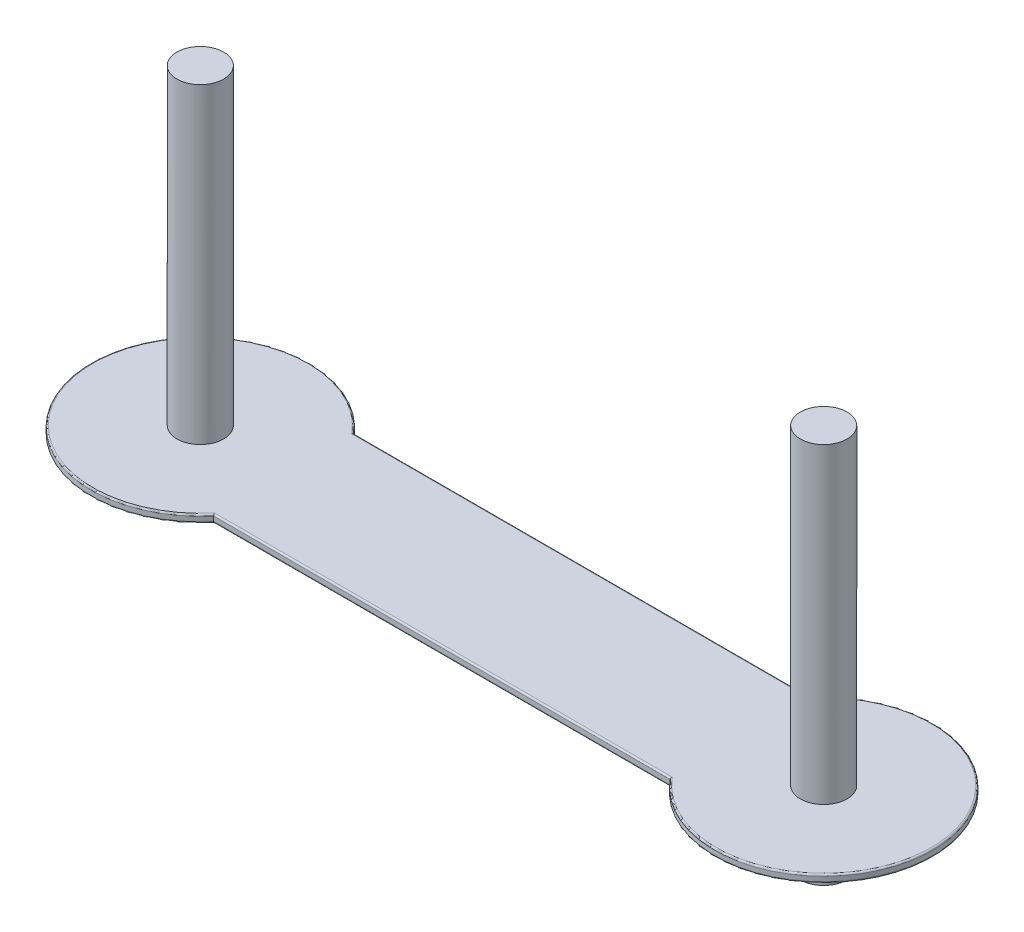
ISO-10303-21;
HEADER;
FILE_DESCRIPTION(('STEP AP214'),'2;1');
FILE_NAME('part.step','',(''),(''),'','','');
FILE_SCHEMA(('AUTOMOTIVE_DESIGN { 1 0 10303 214 1 1 1 1 }'));
ENDSEC;
DATA;
#1=APPLICATION_CONTEXT('core data for automotive mechanical design processes');
#2=APPLICATION_PROTOCOL_DEFINITION('international standard','automotive_design',2000,#1);
#3=PRODUCT_CONTEXT('',#1,'mechanical');
#4=PRODUCT('Part','Part','',(#3));
#5=PRODUCT_RELATED_PRODUCT_CATEGORY('part','',(#4));
#6=PRODUCT_DEFINITION_FORMATION('','',#4);
#7=PRODUCT_DEFINITION_CONTEXT('part definition',#1,'design');
#8=PRODUCT_DEFINITION('design','',#6,#7);
#9=PRODUCT_DEFINITION_SHAPE('','',#8);
#10=(LENGTH_UNIT() NAMED_UNIT(*) SI_UNIT(.MILLI.,.METRE.));
#11=(NAMED_UNIT(*) PLANE_ANGLE_UNIT() SI_UNIT($,.RADIAN.));
#12=(NAMED_UNIT(*) SI_UNIT($,.STERADIAN.) SOLID_ANGLE_UNIT());
#13=UNCERTAINTY_MEASURE_WITH_UNIT(LENGTH_MEASURE(1.E-05),#10,'distance_accuracy_value','');
#14=(GEOMETRIC_REPRESENTATION_CONTEXT(3) GLOBAL_UNCERTAINTY_ASSIGNED_CONTEXT((#13)) GLOBAL_UNIT_ASSIGNED_CONTEXT((#10,
#11,#12)) REPRESENTATION_CONTEXT('',''));
#15=CARTESIAN_POINT('',(0.,0.,0.));
#16=DIRECTION('',(0.,0.,1.));
#17=DIRECTION('',(1.,0.,0.));
#18=AXIS2_PLACEMENT_3D('',#15,#16,#17);
#19=CARTESIAN_POINT('',(-127.,3.175,0.));
#20=DIRECTION('',(0.,-1.,0.));
#21=DIRECTION('',(0.,0.,-1.));
#22=AXIS2_PLACEMENT_3D('',#19,#20,#21);
#23=CYLINDRICAL_SURFACE('',#22,44.45);
#24=DIRECTION('',(0.,-1.,0.));
#25=VECTOR('',#24,1.);
#26=CARTESIAN_POINT('',(-92.9519181891255,3.175,-28.575));
#27=LINE('',#26,#25);
#28=CARTESIAN_POINT('',(-92.9519181891255,2.54,-28.575));
#29=VERTEX_POINT('',#28);
#30=CARTESIAN_POINT('',(-92.9519181891255,0.635,-28.575));
#31=VERTEX_POINT('',#30);
#32=EDGE_CURVE('E119',#29,#31,#27,.T.);
#33=ORIENTED_EDGE('',*,*,#32,.T.);
#34=CARTESIAN_POINT('',(-127.,0.635,0.));
#35=DIRECTION('',(0.,-1.,0.));
#36=DIRECTION('',(0.,0.,-1.));
#37=AXIS2_PLACEMENT_3D('',#34,#35,#36);
#38=CIRCLE('',#37,44.45);
#39=CARTESIAN_POINT('',(-92.9519181891256,0.635,28.575));
#40=VERTEX_POINT('',#39);
#41=EDGE_CURVE('E127',#31,#40,#38,.F.);
#42=ORIENTED_EDGE('',*,*,#41,.T.);
#43=DIRECTION('',(0.,-1.,0.));
#44=VECTOR('',#43,1.);
#45=CARTESIAN_POINT('',(-92.9519181891256,3.175,28.575));
#46=LINE('',#45,#44);
#47=CARTESIAN_POINT('',(-92.9519181891256,2.54,28.575));
#48=VERTEX_POINT('',#47);
#49=EDGE_CURVE('E121',#48,#40,#46,.T.);
#50=ORIENTED_EDGE('',*,*,#49,.F.);
#51=CARTESIAN_POINT('',(-127.,2.54,0.));
#52=DIRECTION('',(0.,-1.,0.));
#53=DIRECTION('',(0.,0.,-1.));
#54=AXIS2_PLACEMENT_3D('',#51,#52,#53);
#55=CIRCLE('',#54,44.45);
#56=EDGE_CURVE('E117',#48,#29,#55,.T.);
#57=ORIENTED_EDGE('',*,*,#56,.T.);
#58=EDGE_LOOP('',(#33,#42,#50,#57));
#59=FACE_BOUND('',#58,.T.);
#60=ADVANCED_FACE('F45',(#59),#23,.T.);
#61=CARTESIAN_POINT('',(-92.9519181891256,3.175,28.575));
#62=DIRECTION('',(0.,0.,-1.));
#63=DIRECTION('',(-1.,0.,0.));
#64=AXIS2_PLACEMENT_3D('',#61,#62,#63);
#65=PLANE('',#64);
#66=ORIENTED_EDGE('',*,*,#49,.T.);
#67=DIRECTION('',(1.,0.,0.));
#68=VECTOR('',#67,1.);
#69=CARTESIAN_POINT('',(92.9519181891255,0.635,28.575));
#70=LINE('',#69,#68);
#71=CARTESIAN_POINT('',(92.9519181891255,0.635,28.575));
#72=VERTEX_POINT('',#71);
#73=EDGE_CURVE('E128',#40,#72,#70,.T.);
#74=ORIENTED_EDGE('',*,*,#73,.T.);
#75=DIRECTION('',(0.,-1.,0.));
#76=VECTOR('',#75,1.);
#77=CARTESIAN_POINT('',(92.9519181891255,3.175,28.575));
#78=LINE('',#77,#76);
#79=CARTESIAN_POINT('',(92.9519181891255,2.54,28.575));
#80=VERTEX_POINT('',#79);
#81=EDGE_CURVE('E311',#80,#72,#78,.T.);
#82=ORIENTED_EDGE('',*,*,#81,.F.);
#83=DIRECTION('',(1.,0.,0.));
#84=VECTOR('',#83,1.);
#85=CARTESIAN_POINT('',(-92.9519181891256,2.54,28.575));
#86=LINE('',#85,#84);
#87=EDGE_CURVE('E285',#80,#48,#86,.F.);
#88=ORIENTED_EDGE('',*,*,#87,.T.);
#89=EDGE_LOOP('',(#66,#74,#82,#88));
#90=FACE_BOUND('',#89,.T.);
#91=ADVANCED_FACE('F197',(#90),#65,.F.);
#92=CARTESIAN_POINT('',(127.,3.175,0.));
#93=DIRECTION('',(0.,-1.,0.));
#94=DIRECTION('',(0.,0.,-1.));
#95=AXIS2_PLACEMENT_3D('',#92,#93,#94);
#96=CYLINDRICAL_SURFACE('',#95,44.45);
#97=ORIENTED_EDGE('',*,*,#81,.T.);
#98=CARTESIAN_POINT('',(127.,0.635,0.));
#99=DIRECTION('',(0.,-1.,0.));
#100=DIRECTION('',(0.,0.,-1.));
#101=AXIS2_PLACEMENT_3D('',#98,#99,#100);
#102=CIRCLE('',#101,44.45);
#103=CARTESIAN_POINT('',(92.9519181891256,0.635,-28.575));
#104=VERTEX_POINT('',#103);
#105=EDGE_CURVE('E282',#72,#104,#102,.F.);
#106=ORIENTED_EDGE('',*,*,#105,.T.);
#107=DIRECTION('',(0.,-1.,0.));
#108=VECTOR('',#107,1.);
#109=CARTESIAN_POINT('',(92.9519181891256,3.175,-28.575));
#110=LINE('',#109,#108);
#111=CARTESIAN_POINT('',(92.9519181891256,2.54,-28.575));
#112=VERTEX_POINT('',#111);
#113=EDGE_CURVE('E141',#112,#104,#110,.T.);
#114=ORIENTED_EDGE('',*,*,#113,.F.);
#115=CARTESIAN_POINT('',(127.,2.54,0.));
#116=DIRECTION('',(0.,-1.,0.));
#117=DIRECTION('',(0.,0.,-1.));
#118=AXIS2_PLACEMENT_3D('',#115,#116,#117);
#119=CIRCLE('',#118,44.45);
#120=EDGE_CURVE('E279',#112,#80,#119,.T.);
#121=ORIENTED_EDGE('',*,*,#120,.T.);
#122=EDGE_LOOP('',(#97,#106,#114,#121));
#123=FACE_BOUND('',#122,.T.);
#124=ADVANCED_FACE('F203',(#123),#96,.T.);
#125=CARTESIAN_POINT('',(92.9519181891256,3.175,-28.575));
#126=DIRECTION('',(0.,0.,1.));
#127=DIRECTION('',(1.,0.,0.));
#128=AXIS2_PLACEMENT_3D('',#125,#126,#127);
#129=PLANE('',#128);
#130=ORIENTED_EDGE('',*,*,#113,.T.);
#131=DIRECTION('',(-1.,0.,0.));
#132=VECTOR('',#131,1.);
#133=CARTESIAN_POINT('',(-92.9519181891255,0.635,-28.575));
#134=LINE('',#133,#132);
#135=EDGE_CURVE('E139',#104,#31,#134,.T.);
#136=ORIENTED_EDGE('',*,*,#135,.T.);
#137=ORIENTED_EDGE('',*,*,#32,.F.);
#138=DIRECTION('',(-1.,0.,0.));
#139=VECTOR('',#138,1.);
#140=CARTESIAN_POINT('',(92.9519181891256,2.54,-28.575));
#141=LINE('',#140,#139);
#142=EDGE_CURVE('E136',#29,#112,#141,.F.);
#143=ORIENTED_EDGE('',*,*,#142,.T.);
#144=EDGE_LOOP('',(#130,#136,#137,#143));
#145=FACE_BOUND('',#144,.T.);
#146=ADVANCED_FACE('F135',(#145),#129,.F.);
#147=CARTESIAN_POINT('',(-127.,3.175,0.));
#148=DIRECTION('',(0.,-1.,0.));
#149=DIRECTION('',(0.,0.,-1.));
#150=AXIS2_PLACEMENT_3D('',#147,#148,#149);
#151=PLANE('',#150);
#152=CARTESIAN_POINT('',(127.,3.175,0.));
#153=DIRECTION('',(0.,-1.,0.));
#154=DIRECTION('',(0.,0.,-1.));
#155=AXIS2_PLACEMENT_3D('',#152,#153,#154);
#156=CIRCLE('',#155,43.815);
#157=CARTESIAN_POINT('',(93.2492870445675,3.175,27.94));
#158=VERTEX_POINT('',#157);
#159=CARTESIAN_POINT('',(93.2492870445675,3.175,-27.94));
#160=VERTEX_POINT('',#159);
#161=EDGE_CURVE('E60',#158,#160,#156,.F.);
#162=ORIENTED_EDGE('',*,*,#161,.T.);
#163=DIRECTION('',(-1.,0.,0.));
#164=VECTOR('',#163,1.);
#165=CARTESIAN_POINT('',(-127.,3.175,-27.94));
#166=LINE('',#165,#164);
#167=CARTESIAN_POINT('',(-93.2492870445675,3.175,-27.94));
#168=VERTEX_POINT('',#167);
#169=EDGE_CURVE('E11',#160,#168,#166,.T.);
#170=ORIENTED_EDGE('',*,*,#169,.T.);
#171=CARTESIAN_POINT('',(-127.,3.175,0.));
#172=DIRECTION('',(0.,-1.,0.));
#173=DIRECTION('',(0.,0.,-1.));
#174=AXIS2_PLACEMENT_3D('',#171,#172,#173);
#175=CIRCLE('',#174,43.815);
#176=CARTESIAN_POINT('',(-93.2492870445675,3.175,27.94));
#177=VERTEX_POINT('',#176);
#178=EDGE_CURVE('E155',#168,#177,#175,.F.);
#179=ORIENTED_EDGE('',*,*,#178,.T.);
#180=DIRECTION('',(1.,0.,0.));
#181=VECTOR('',#180,1.);
#182=CARTESIAN_POINT('',(-127.,3.175,27.94));
#183=LINE('',#182,#181);
#184=EDGE_CURVE('E71',#177,#158,#183,.T.);
#185=ORIENTED_EDGE('',*,*,#184,.T.);
#186=EDGE_LOOP('',(#162,#170,#179,#185));
#187=FACE_BOUND('',#186,.T.);
#188=CARTESIAN_POINT('',(127.,3.175,0.));
#189=DIRECTION('',(0.,-1.,0.));
#190=DIRECTION('',(0.,0.,-1.));
#191=AXIS2_PLACEMENT_3D('',#188,#189,#190);
#192=CIRCLE('',#191,9.52499999999996);
#193=CARTESIAN_POINT('',(127.,3.175,-9.52499999999996));
#194=VERTEX_POINT('',#193);
#195=EDGE_CURVE('E356',#194,#194,#192,.T.);
#196=ORIENTED_EDGE('',*,*,#195,.T.);
#197=EDGE_LOOP('',(#196));
#198=FACE_BOUND('',#197,.T.);
#199=CARTESIAN_POINT('',(-127.,3.17500000000001,0.));
#200=DIRECTION('',(0.,-1.,0.));
#201=DIRECTION('',(0.,0.,-1.));
#202=AXIS2_PLACEMENT_3D('',#199,#200,#201);
#203=CIRCLE('',#202,9.52500000000001);
#204=CARTESIAN_POINT('',(-127.,3.17500000000001,-9.52499999999998));
#205=VERTEX_POINT('',#204);
#206=EDGE_CURVE('E310',#205,#205,#203,.F.);
#207=ORIENTED_EDGE('',*,*,#206,.F.);
#208=EDGE_LOOP('',(#207));
#209=FACE_BOUND('',#208,.T.);
#210=ADVANCED_FACE('F297',(#187,#198,#209),#151,.F.);
#211=CARTESIAN_POINT('',(-127.,0.,0.));
#212=DIRECTION('',(0.,-1.,0.));
#213=DIRECTION('',(0.,0.,-1.));
#214=AXIS2_PLACEMENT_3D('',#211,#212,#213);
#215=PLANE('',#214);
#216=CARTESIAN_POINT('',(-127.,0.,0.));
#217=DIRECTION('',(0.,-1.,0.));
#218=DIRECTION('',(0.,0.,-1.));
#219=AXIS2_PLACEMENT_3D('',#216,#217,#218);
#220=CIRCLE('',#219,43.815);
#221=CARTESIAN_POINT('',(-93.2492870445675,0.,27.94));
#222=VERTEX_POINT('',#221);
#223=CARTESIAN_POINT('',(-93.2492870445675,0.,-27.94));
#224=VERTEX_POINT('',#223);
#225=EDGE_CURVE('E262',#222,#224,#220,.T.);
#226=ORIENTED_EDGE('',*,*,#225,.T.);
#227=DIRECTION('',(-1.,0.,0.));
#228=VECTOR('',#227,1.);
#229=CARTESIAN_POINT('',(92.9519181891256,0.,-27.94));
#230=LINE('',#229,#228);
#231=CARTESIAN_POINT('',(93.2492870445675,0.,-27.94));
#232=VERTEX_POINT('',#231);
#233=EDGE_CURVE('E276',#224,#232,#230,.F.);
#234=ORIENTED_EDGE('',*,*,#233,.T.);
#235=CARTESIAN_POINT('',(127.,0.,0.));
#236=DIRECTION('',(0.,-1.,0.));
#237=DIRECTION('',(0.,0.,-1.));
#238=AXIS2_PLACEMENT_3D('',#235,#236,#237);
#239=CIRCLE('',#238,43.815);
#240=CARTESIAN_POINT('',(93.2492870445675,0.,27.94));
#241=VERTEX_POINT('',#240);
#242=EDGE_CURVE('E270',#232,#241,#239,.T.);
#243=ORIENTED_EDGE('',*,*,#242,.T.);
#244=DIRECTION('',(1.,0.,0.));
#245=VECTOR('',#244,1.);
#246=CARTESIAN_POINT('',(-92.9519181891256,0.,27.94));
#247=LINE('',#246,#245);
#248=EDGE_CURVE('E256',#241,#222,#247,.F.);
#249=ORIENTED_EDGE('',*,*,#248,.T.);
#250=EDGE_LOOP('',(#226,#234,#243,#249));
#251=FACE_BOUND('',#250,.T.);
#252=CARTESIAN_POINT('',(127.,0.,0.));
#253=DIRECTION('',(0.,-1.,0.));
#254=DIRECTION('',(0.,0.,-1.));
#255=AXIS2_PLACEMENT_3D('',#252,#253,#254);
#256=CIRCLE('',#255,9.52499999999996);
#257=CARTESIAN_POINT('',(127.,0.,-9.52499999999996));
#258=VERTEX_POINT('',#257);
#259=EDGE_CURVE('E152',#258,#258,#256,.T.);
#260=ORIENTED_EDGE('',*,*,#259,.F.);
#261=EDGE_LOOP('',(#260));
#262=FACE_BOUND('',#261,.T.);
#263=ADVANCED_FACE('F327',(#251,#262),#215,.T.);
#264=CARTESIAN_POINT('',(-127.,130.175,0.));
#265=DIRECTION('',(0.,-1.,0.));
#266=DIRECTION('',(0.,0.,-1.));
#267=AXIS2_PLACEMENT_3D('',#264,#265,#266);
#268=CYLINDRICAL_SURFACE('',#267,9.52500000000001);
#269=CARTESIAN_POINT('',(-127.,130.175,0.));
#270=DIRECTION('',(0.,1.,0.));
#271=DIRECTION('',(0.,0.,1.));
#272=AXIS2_PLACEMENT_3D('',#269,#270,#271);
#273=CIRCLE('',#272,9.52500000000001);
#274=CARTESIAN_POINT('',(-127.,130.175,9.52500000000004));
#275=VERTEX_POINT('',#274);
#276=EDGE_CURVE('E142',#275,#275,#273,.T.);
#277=ORIENTED_EDGE('',*,*,#276,.F.);
#278=EDGE_LOOP('',(#277));
#279=FACE_BOUND('',#278,.T.);
#280=ORIENTED_EDGE('',*,*,#206,.T.);
#281=EDGE_LOOP('',(#280));
#282=FACE_BOUND('',#281,.T.);
#283=ADVANCED_FACE('F328',(#279,#282),#268,.T.);
#284=CARTESIAN_POINT('',(-127.,130.175,0.));
#285=DIRECTION('',(0.,1.,0.));
#286=DIRECTION('',(0.,0.,1.));
#287=AXIS2_PLACEMENT_3D('',#284,#285,#286);
#288=PLANE('',#287);
#289=ORIENTED_EDGE('',*,*,#276,.T.);
#290=EDGE_LOOP('',(#289));
#291=FACE_BOUND('',#290,.T.);
#292=ADVANCED_FACE('F334',(#291),#288,.T.);
#293=CARTESIAN_POINT('',(127.,-25.4,0.));
#294=DIRECTION('',(0.,1.,0.));
#295=DIRECTION('',(0.,0.,1.));
#296=AXIS2_PLACEMENT_3D('',#293,#294,#295);
#297=PLANE('',#296);
#298=CARTESIAN_POINT('',(127.,-25.4,0.));
#299=DIRECTION('',(0.,1.,0.));
#300=DIRECTION('',(0.,0.,1.));
#301=AXIS2_PLACEMENT_3D('',#298,#299,#300);
#302=CIRCLE('',#301,9.52499999999996);
#303=CARTESIAN_POINT('',(127.,-25.4,9.52499999999996));
#304=VERTEX_POINT('',#303);
#305=EDGE_CURVE('E351',#304,#304,#302,.T.);
#306=ORIENTED_EDGE('',*,*,#305,.F.);
#307=EDGE_LOOP('',(#306));
#308=FACE_BOUND('',#307,.T.);
#309=ADVANCED_FACE('F371',(#308),#297,.F.);
#310=CARTESIAN_POINT('',(127.,-25.4,0.));
#311=DIRECTION('',(0.,1.,0.));
#312=DIRECTION('',(0.,0.,1.));
#313=AXIS2_PLACEMENT_3D('',#310,#311,#312);
#314=CYLINDRICAL_SURFACE('',#313,9.52499999999996);
#315=ORIENTED_EDGE('',*,*,#259,.T.);
#316=EDGE_LOOP('',(#315));
#317=FACE_BOUND('',#316,.T.);
#318=ORIENTED_EDGE('',*,*,#305,.T.);
#319=EDGE_LOOP('',(#318));
#320=FACE_BOUND('',#319,.T.);
#321=ADVANCED_FACE('F324',(#317,#320),#314,.T.);
#322=CARTESIAN_POINT('',(127.,130.175,0.));
#323=DIRECTION('',(0.,1.,0.));
#324=DIRECTION('',(0.,0.,1.));
#325=AXIS2_PLACEMENT_3D('',#322,#323,#324);
#326=CIRCLE('',#325,9.52499999999996);
#327=CARTESIAN_POINT('',(127.,130.175,9.52499999999996));
#328=VERTEX_POINT('',#327);
#329=EDGE_CURVE('E347',#328,#328,#326,.T.);
#330=ORIENTED_EDGE('',*,*,#329,.F.);
#331=EDGE_LOOP('',(#330));
#332=FACE_BOUND('',#331,.T.);
#333=ORIENTED_EDGE('',*,*,#195,.F.);
#334=EDGE_LOOP('',(#333));
#335=FACE_BOUND('',#334,.T.);
#336=ADVANCED_FACE('F247',(#332,#335),#314,.T.);
#337=CARTESIAN_POINT('',(127.,130.175,0.));
#338=DIRECTION('',(0.,1.,0.));
#339=DIRECTION('',(0.,0.,1.));
#340=AXIS2_PLACEMENT_3D('',#337,#338,#339);
#341=PLANE('',#340);
#342=ORIENTED_EDGE('',*,*,#329,.T.);
#343=EDGE_LOOP('',(#342));
#344=FACE_BOUND('',#343,.T.);
#345=ADVANCED_FACE('F241',(#344),#341,.T.);
#346=CARTESIAN_POINT('',(-92.9519181891256,0.635,27.94));
#347=DIRECTION('',(-1.,0.,0.));
#348=DIRECTION('',(0.,0.,1.));
#349=AXIS2_PLACEMENT_3D('',#346,#347,#348);
#350=CYLINDRICAL_SURFACE('',#349,0.635);
#351=CARTESIAN_POINT('',(-92.9519181891256,0.635,28.575));
#352=CARTESIAN_POINT('',(-92.9519000690773,0.601678653821247,28.5750394021504));
#353=CARTESIAN_POINT('',(-92.9531397768955,0.56838559440662,28.5723799878432));
#354=CARTESIAN_POINT('',(-92.957991182427,0.502888793551069,28.5619757165325));
#355=CARTESIAN_POINT('',(-92.9615951356801,0.470681855272648,28.5542474633297));
#356=CARTESIAN_POINT('',(-92.9710309494502,0.408174635970745,28.5340185471485));
#357=CARTESIAN_POINT('',(-92.9768618227916,0.377873517035022,28.5215199988049));
#358=CARTESIAN_POINT('',(-92.9905193658937,0.319890606059719,28.4922551558196));
#359=CARTESIAN_POINT('',(-92.998347055114,0.292210161913789,28.4754866812065));
#360=CARTESIAN_POINT('',(-93.0160538323616,0.239079797363762,28.4375713756068));
#361=CARTESIAN_POINT('',(-93.0259989264897,0.213752701306818,28.4162837529325));
#362=CARTESIAN_POINT('',(-93.0474245060057,0.167010457954683,28.3704454467679));
#363=CARTESIAN_POINT('',(-93.0589054635671,0.145596518498023,28.3458937598144));
#364=CARTESIAN_POINT('',(-93.0841600008306,0.105271927238983,28.2919182632674));
#365=CARTESIAN_POINT('',(-93.0980466333784,0.0867524357029992,28.2622554092274));
#366=CARTESIAN_POINT('',(-93.1268793022116,0.0549506683469874,28.2007078102434));
#367=CARTESIAN_POINT('',(-93.1418259397677,0.0416713934432824,28.1688218044284));
#368=CARTESIAN_POINT('',(-93.1716608140322,0.0210031753433222,28.1052187453314));
#369=CARTESIAN_POINT('',(-93.186516936976,0.013360489976038,28.0735680561674));
#370=CARTESIAN_POINT('',(-93.2165311703958,0.00300652726968431,28.0096666709503));
#371=CARTESIAN_POINT('',(-93.231688601593,0.000285202760250801,27.9774173334421));
#372=CARTESIAN_POINT('',(-93.2476577167473,7.0716198331565E-06,27.9434640606723));
#373=CARTESIAN_POINT('',(-93.2484723981043,-1.57192980673113E-08,27.9417319615877));
#374=CARTESIAN_POINT('',(-93.2492870445675,0.,27.94));
#375=B_SPLINE_CURVE_WITH_KNOTS('',3,(#351,#352,#353,#354,#355,#356,#357,#358,#359,#360,#361,
#362,#363,#364,#365,#366,#367,#368,#369,#370,#371,#372,#373,#374),.UNSPECIFIED.,.F.,.F.,(4,2,2,
2,2,2,2,2,2,2,2,4),(0.,0.0997910014508765,0.199256743015672,0.298678443306542,0.398151004556693,
0.501359653404448,0.604600105118342,0.717008472453579,0.829481119624646,0.936516009933089,
1.04333213615029,1.04907448757736),.UNSPECIFIED.);
#376=EDGE_CURVE('E228',#222,#40,#375,.F.);
#377=ORIENTED_EDGE('',*,*,#376,.F.);
#378=ORIENTED_EDGE('',*,*,#248,.F.);
#379=CARTESIAN_POINT('',(92.9519181891255,0.635,28.575));
#380=CARTESIAN_POINT('',(92.9519000690773,0.601678653821248,28.5750394021504));
#381=CARTESIAN_POINT('',(92.9531397768955,0.568385594406621,28.5723799878432));
#382=CARTESIAN_POINT('',(92.9579911824271,0.502888793551068,28.5619757165325));
#383=CARTESIAN_POINT('',(92.9615951356802,0.470681855272647,28.5542474633297));
#384=CARTESIAN_POINT('',(92.9710309494502,0.408174635970742,28.5340185471485));
#385=CARTESIAN_POINT('',(92.9768618227916,0.377873517035018,28.5215199988049));
#386=CARTESIAN_POINT('',(92.9905193658937,0.319890606059716,28.4922551558196));
#387=CARTESIAN_POINT('',(92.998347055114,0.292210161913787,28.4754866812065));
#388=CARTESIAN_POINT('',(93.0160538323616,0.239079797363763,28.4375713756068));
#389=CARTESIAN_POINT('',(93.0259989264897,0.21375270130682,28.4162837529325));
#390=CARTESIAN_POINT('',(93.0474245060057,0.167010457954685,28.3704454467679));
#391=CARTESIAN_POINT('',(93.0589054635671,0.145596518498025,28.3458937598144));
#392=CARTESIAN_POINT('',(93.0841600008306,0.105271927238985,28.2919182632674));
#393=CARTESIAN_POINT('',(93.0980466333784,0.0867524357029992,28.2622554092274));
#394=CARTESIAN_POINT('',(93.1268793022116,0.0549506683469867,28.2007078102434));
#395=CARTESIAN_POINT('',(93.1418259397678,0.0416713934432829,28.1688218044284));
#396=CARTESIAN_POINT('',(93.1716608140322,0.0210031753433226,28.1052187453314));
#397=CARTESIAN_POINT('',(93.186516936976,0.0133604899760366,28.0735680561674));
#398=CARTESIAN_POINT('',(93.2165311703959,0.00300652726968312,28.0096666709504));
#399=CARTESIAN_POINT('',(93.2316886015932,0.000285202760251281,27.9774173334422));
#400=CARTESIAN_POINT('',(93.2476577167473,7.07161983323827E-06,27.9434640606723));
#401=CARTESIAN_POINT('',(93.2484723981044,-1.57192980128847E-08,27.9417319615877));
#402=CARTESIAN_POINT('',(93.2492870445675,0.,27.94));
#403=B_SPLINE_CURVE_WITH_KNOTS('',3,(#379,#380,#381,#382,#383,#384,#385,#386,#387,#388,#389,
#390,#391,#392,#393,#394,#395,#396,#397,#398,#399,#400,#401,#402),.UNSPECIFIED.,.F.,.F.,(4,2,2,
2,2,2,2,2,2,2,2,4),(0.,0.099791001450877,0.199256743015672,0.298678443306548,0.398151004556696,
0.501359653404441,0.604600105118344,0.717008472453578,0.829481119624657,0.936516009933097,
1.04333213615029,1.04907448757735),.UNSPECIFIED.);
#404=EDGE_CURVE('E168',#72,#241,#403,.T.);
#405=ORIENTED_EDGE('',*,*,#404,.F.);
#406=ORIENTED_EDGE('',*,*,#73,.F.);
#407=EDGE_LOOP('',(#377,#378,#405,#406));
#408=FACE_BOUND('',#407,.T.);
#409=ADVANCED_FACE('F236',(#408),#350,.T.);
#410=CARTESIAN_POINT('',(127.,0.635,0.));
#411=DIRECTION('',(0.,-1.,0.));
#412=DIRECTION('',(0.,0.,-1.));
#413=AXIS2_PLACEMENT_3D('',#410,#411,#412);
#414=TOROIDAL_SURFACE('',#413,43.815,0.635);
#415=ORIENTED_EDGE('',*,*,#404,.T.);
#416=ORIENTED_EDGE('',*,*,#242,.F.);
#417=CARTESIAN_POINT('',(92.9519181891256,0.635,-28.575));
#418=CARTESIAN_POINT('',(92.9519000690773,0.601678653821249,-28.5750394021504));
#419=CARTESIAN_POINT('',(92.9531397768955,0.568385594406622,-28.5723799878432));
#420=CARTESIAN_POINT('',(92.9579911824271,0.502888793551069,-28.5619757165325));
#421=CARTESIAN_POINT('',(92.9615951356802,0.470681855272647,-28.5542474633297));
#422=CARTESIAN_POINT('',(92.9710309494502,0.408174635970744,-28.5340185471485));
#423=CARTESIAN_POINT('',(92.9768618227916,0.377873517035023,-28.5215199988049));
#424=CARTESIAN_POINT('',(92.9905193658937,0.31989060605972,-28.4922551558196));
#425=CARTESIAN_POINT('',(92.998347055114,0.292210161913789,-28.4754866812065));
#426=CARTESIAN_POINT('',(93.0160538323616,0.239079797363762,-28.4375713756068));
#427=CARTESIAN_POINT('',(93.0259989264897,0.213752701306819,-28.4162837529325));
#428=CARTESIAN_POINT('',(93.0474245060058,0.167010457954684,-28.3704454467679));
#429=CARTESIAN_POINT('',(93.0589054635671,0.145596518498024,-28.3458937598144));
#430=CARTESIAN_POINT('',(93.0841600008306,0.105271927238984,-28.2919182632674));
#431=CARTESIAN_POINT('',(93.0980466333784,0.0867524357030004,-28.2622554092274));
#432=CARTESIAN_POINT('',(93.1268793022116,0.0549506683469884,-28.2007078102434));
#433=CARTESIAN_POINT('',(93.1418259397678,0.041671393443283,-28.1688218044284));
#434=CARTESIAN_POINT('',(93.1716608140322,0.0210031753433225,-28.1052187453314));
#435=CARTESIAN_POINT('',(93.186516936976,0.0133604899760382,-28.0735680561674));
#436=CARTESIAN_POINT('',(93.2165311703959,0.00300652726968469,-28.0096666709503));
#437=CARTESIAN_POINT('',(93.2316886015931,0.000285202760251183,-27.9774173334421));
#438=CARTESIAN_POINT('',(93.2476577167473,7.07161983320866E-06,-27.9434640606723));
#439=CARTESIAN_POINT('',(93.2484723981044,-1.57192980336552E-08,-27.9417319615877));
#440=CARTESIAN_POINT('',(93.2492870445675,0.,-27.94));
#441=B_SPLINE_CURVE_WITH_KNOTS('',3,(#417,#418,#419,#420,#421,#422,#423,#424,#425,#426,#427,
#428,#429,#430,#431,#432,#433,#434,#435,#436,#437,#438,#439,#440),.UNSPECIFIED.,.F.,.F.,(4,2,2,
2,2,2,2,2,2,2,2,4),(0.,0.0997910014508769,0.199256743015671,0.298678443306544,0.398151004556696,
0.501359653404449,0.604600105118343,0.717008472453577,0.829481119624648,0.93651600993309,
1.04333213615029,1.04907448757735),.UNSPECIFIED.);
#442=EDGE_CURVE('E222',#104,#232,#441,.T.);
#443=ORIENTED_EDGE('',*,*,#442,.F.);
#444=ORIENTED_EDGE('',*,*,#105,.F.);
#445=EDGE_LOOP('',(#415,#416,#443,#444));
#446=FACE_BOUND('',#445,.T.);
#447=ADVANCED_FACE('F233',(#446),#414,.T.);
#448=CARTESIAN_POINT('',(-127.,0.635,0.));
#449=DIRECTION('',(0.,-1.,0.));
#450=DIRECTION('',(0.,0.,-1.));
#451=AXIS2_PLACEMENT_3D('',#448,#449,#450);
#452=TOROIDAL_SURFACE('',#451,43.815,0.635);
#453=ORIENTED_EDGE('',*,*,#376,.T.);
#454=ORIENTED_EDGE('',*,*,#41,.F.);
#455=CARTESIAN_POINT('',(-92.9519181891255,0.635,-28.575));
#456=CARTESIAN_POINT('',(-92.9519000690773,0.601678653821249,-28.5750394021503));
#457=CARTESIAN_POINT('',(-92.9531397768955,0.568385594406622,-28.5723799878432));
#458=CARTESIAN_POINT('',(-92.9579911824271,0.502888793551069,-28.5619757165325));
#459=CARTESIAN_POINT('',(-92.9615951356802,0.470681855272647,-28.5542474633297));
#460=CARTESIAN_POINT('',(-92.9710309494502,0.408174635970742,-28.5340185471485));
#461=CARTESIAN_POINT('',(-92.9768618227916,0.377873517035018,-28.5215199988048));
#462=CARTESIAN_POINT('',(-92.9905193658937,0.319890606059716,-28.4922551558196));
#463=CARTESIAN_POINT('',(-92.998347055114,0.292210161913786,-28.4754866812065));
#464=CARTESIAN_POINT('',(-93.0160538323616,0.239079797363762,-28.4375713756068));
#465=CARTESIAN_POINT('',(-93.0259989264897,0.213752701306819,-28.4162837529325));
#466=CARTESIAN_POINT('',(-93.0474245060058,0.167010457954684,-28.3704454467678));
#467=CARTESIAN_POINT('',(-93.0589054635671,0.145596518498024,-28.3458937598143));
#468=CARTESIAN_POINT('',(-93.0841600008306,0.105271927238984,-28.2919182632673));
#469=CARTESIAN_POINT('',(-93.0980466333784,0.0867524357029991,-28.2622554092274));
#470=CARTESIAN_POINT('',(-93.1268793022116,0.054950668346987,-28.2007078102434));
#471=CARTESIAN_POINT('',(-93.1418259397678,0.0416713934432829,-28.1688218044284));
#472=CARTESIAN_POINT('',(-93.1716608140322,0.0210031753433225,-28.1052187453314));
#473=CARTESIAN_POINT('',(-93.186516936976,0.0133604899760366,-28.0735680561674));
#474=CARTESIAN_POINT('',(-93.2165311703959,0.00300652726968315,-28.0096666709503));
#475=CARTESIAN_POINT('',(-93.2316886015932,0.000285202760251283,-27.9774173334421));
#476=CARTESIAN_POINT('',(-93.2476577167473,7.0716198332382E-06,-27.9434640606723));
#477=CARTESIAN_POINT('',(-93.2484723981044,-1.57192980129611E-08,-27.9417319615876));
#478=CARTESIAN_POINT('',(-93.2492870445675,0.,-27.94));
#479=B_SPLINE_CURVE_WITH_KNOTS('',3,(#455,#456,#457,#458,#459,#460,#461,#462,#463,#464,#465,
#466,#467,#468,#469,#470,#471,#472,#473,#474,#475,#476,#477,#478),.UNSPECIFIED.,.F.,.F.,(4,2,2,
2,2,2,2,2,2,2,2,4),(0.,0.0997910014508774,0.199256743015673,0.29867844330655,0.398151004556698,
0.501359653404451,0.604600105118345,0.717008472453579,0.829481119624658,0.936516009933098,
1.04333213615029,1.04907448757736),.UNSPECIFIED.);
#480=EDGE_CURVE('E216',#224,#31,#479,.F.);
#481=ORIENTED_EDGE('',*,*,#480,.F.);
#482=ORIENTED_EDGE('',*,*,#225,.F.);
#483=EDGE_LOOP('',(#453,#454,#481,#482));
#484=FACE_BOUND('',#483,.T.);
#485=ADVANCED_FACE('F211',(#484),#452,.T.);
#486=CARTESIAN_POINT('',(92.9519181891256,0.635,-27.94));
#487=DIRECTION('',(1.,0.,0.));
#488=DIRECTION('',(0.,0.,-1.));
#489=AXIS2_PLACEMENT_3D('',#486,#487,#488);
#490=CYLINDRICAL_SURFACE('',#489,0.635);
#491=ORIENTED_EDGE('',*,*,#442,.T.);
#492=ORIENTED_EDGE('',*,*,#233,.F.);
#493=ORIENTED_EDGE('',*,*,#480,.T.);
#494=ORIENTED_EDGE('',*,*,#135,.F.);
#495=EDGE_LOOP('',(#491,#492,#493,#494));
#496=FACE_BOUND('',#495,.T.);
#497=ADVANCED_FACE('F193',(#496),#490,.T.);
#498=CARTESIAN_POINT('',(-127.,2.54,27.94));
#499=DIRECTION('',(1.,0.,0.));
#500=DIRECTION('',(0.,0.,-1.));
#501=AXIS2_PLACEMENT_3D('',#498,#499,#500);
#502=CYLINDRICAL_SURFACE('',#501,0.635);
#503=CARTESIAN_POINT('',(-92.9519181891256,2.54,28.575));
#504=CARTESIAN_POINT('',(-92.9519000690773,2.57332134617875,28.5750394021504));
#505=CARTESIAN_POINT('',(-92.9531397768955,2.60661440559338,28.5723799878432));
#506=CARTESIAN_POINT('',(-92.957991182427,2.67211120644893,28.5619757165325));
#507=CARTESIAN_POINT('',(-92.9615951356801,2.70431814472735,28.5542474633297));
#508=CARTESIAN_POINT('',(-92.9710309494502,2.76682536402925,28.5340185471485));
#509=CARTESIAN_POINT('',(-92.9768618227916,2.79712648296498,28.5215199988049));
#510=CARTESIAN_POINT('',(-92.9905193658937,2.85510939394028,28.4922551558196));
#511=CARTESIAN_POINT('',(-92.998347055114,2.88278983808621,28.4754866812065));
#512=CARTESIAN_POINT('',(-93.0160538323616,2.93592020263624,28.4375713756068));
#513=CARTESIAN_POINT('',(-93.0259989264897,2.96124729869318,28.4162837529325));
#514=CARTESIAN_POINT('',(-93.0474245060057,3.00798954204532,28.3704454467679));
#515=CARTESIAN_POINT('',(-93.0589054635671,3.02940348150198,28.3458937598144));
#516=CARTESIAN_POINT('',(-93.0841600008306,3.06972807276102,28.2919182632674));
#517=CARTESIAN_POINT('',(-93.0980466333784,3.088247564297,28.2622554092274));
#518=CARTESIAN_POINT('',(-93.1268793022116,3.12004933165301,28.2007078102434));
#519=CARTESIAN_POINT('',(-93.1418259397677,3.13332860655672,28.1688218044284));
#520=CARTESIAN_POINT('',(-93.1716608140322,3.15399682465668,28.1052187453314));
#521=CARTESIAN_POINT('',(-93.186516936976,3.16163951002396,28.0735680561674));
#522=CARTESIAN_POINT('',(-93.2165311703959,3.17199347273032,28.0096666709503));
#523=CARTESIAN_POINT('',(-93.2316886015931,3.17471479723975,27.9774173334421));
#524=CARTESIAN_POINT('',(-93.2476577167473,3.17499292838017,27.9434640606723));
#525=CARTESIAN_POINT('',(-93.2484723981043,3.1750000157193,27.9417319615877));
#526=CARTESIAN_POINT('',(-93.2492870445675,3.175,27.94));
#527=B_SPLINE_CURVE_WITH_KNOTS('',3,(#503,#504,#505,#506,#507,#508,#509,#510,#511,#512,#513,
#514,#515,#516,#517,#518,#519,#520,#521,#522,#523,#524,#525,#526),.UNSPECIFIED.,.F.,.F.,(4,2,2,
2,2,2,2,2,2,2,2,4),(0.,0.099791001450877,0.199256743015672,0.298678443306542,0.398151004556693,
0.501359653404447,0.604600105118341,0.717008472453571,0.829481119624649,0.936516009933091,
1.04333213615029,1.04907448757736),.UNSPECIFIED.);
#528=EDGE_CURVE('E159',#48,#177,#527,.T.);
#529=ORIENTED_EDGE('',*,*,#528,.F.);
#530=ORIENTED_EDGE('',*,*,#87,.F.);
#531=CARTESIAN_POINT('',(92.9519181891255,2.54,28.575));
#532=CARTESIAN_POINT('',(92.9519000690773,2.57332134617875,28.5750394021504));
#533=CARTESIAN_POINT('',(92.9531397768955,2.60661440559338,28.5723799878432));
#534=CARTESIAN_POINT('',(92.9579911824271,2.67211120644893,28.5619757165325));
#535=CARTESIAN_POINT('',(92.9615951356802,2.70431814472735,28.5542474633297));
#536=CARTESIAN_POINT('',(92.9710309494502,2.76682536402926,28.5340185471485));
#537=CARTESIAN_POINT('',(92.9768618227916,2.79712648296498,28.5215199988049));
#538=CARTESIAN_POINT('',(92.9905193658937,2.85510939394028,28.4922551558196));
#539=CARTESIAN_POINT('',(92.998347055114,2.88278983808621,28.4754866812065));
#540=CARTESIAN_POINT('',(93.0160538323616,2.93592020263624,28.4375713756068));
#541=CARTESIAN_POINT('',(93.0259989264897,2.96124729869318,28.4162837529325));
#542=CARTESIAN_POINT('',(93.0474245060058,3.00798954204532,28.3704454467679));
#543=CARTESIAN_POINT('',(93.0589054635671,3.02940348150198,28.3458937598144));
#544=CARTESIAN_POINT('',(93.0841600008306,3.06972807276102,28.2919182632674));
#545=CARTESIAN_POINT('',(93.0980466333784,3.088247564297,28.2622554092274));
#546=CARTESIAN_POINT('',(93.1268793022116,3.12004933165301,28.2007078102434));
#547=CARTESIAN_POINT('',(93.1418259397678,3.13332860655672,28.1688218044284));
#548=CARTESIAN_POINT('',(93.1716608140322,3.15399682465668,28.1052187453314));
#549=CARTESIAN_POINT('',(93.186516936976,3.16163951002396,28.0735680561674));
#550=CARTESIAN_POINT('',(93.2165311703959,3.17199347273032,28.0096666709504));
#551=CARTESIAN_POINT('',(93.2316886015932,3.17471479723975,27.9774173334422));
#552=CARTESIAN_POINT('',(93.2476577167473,3.17499292838017,27.9434640606723));
#553=CARTESIAN_POINT('',(93.2484723981044,3.1750000157193,27.9417319615877));
#554=CARTESIAN_POINT('',(93.2492870445675,3.175,27.94));
#555=B_SPLINE_CURVE_WITH_KNOTS('',3,(#531,#532,#533,#534,#535,#536,#537,#538,#539,#540,#541,
#542,#543,#544,#545,#546,#547,#548,#549,#550,#551,#552,#553,#554),.UNSPECIFIED.,.F.,.F.,(4,2,2,
2,2,2,2,2,2,2,2,4),(0.,0.0997910014508777,0.199256743015672,0.298678443306544,0.398151004556697,
0.50135965340445,0.604600105118344,0.717008472453585,0.829481119624657,0.9365160099331,
1.04333213615029,1.04907448757735),.UNSPECIFIED.);
#556=EDGE_CURVE('E50',#158,#80,#555,.F.);
#557=ORIENTED_EDGE('',*,*,#556,.F.);
#558=ORIENTED_EDGE('',*,*,#184,.F.);
#559=EDGE_LOOP('',(#529,#530,#557,#558));
#560=FACE_BOUND('',#559,.T.);
#561=ADVANCED_FACE('F47',(#560),#502,.T.);
#562=CARTESIAN_POINT('',(127.,2.54,0.));
#563=DIRECTION('',(0.,-1.,0.));
#564=DIRECTION('',(0.,0.,-1.));
#565=AXIS2_PLACEMENT_3D('',#562,#563,#564);
#566=TOROIDAL_SURFACE('',#565,43.815,0.635);
#567=ORIENTED_EDGE('',*,*,#556,.T.);
#568=ORIENTED_EDGE('',*,*,#120,.F.);
#569=CARTESIAN_POINT('',(92.9519181891256,2.54,-28.575));
#570=CARTESIAN_POINT('',(92.9519000690773,2.57332134617875,-28.5750394021504));
#571=CARTESIAN_POINT('',(92.9531397768955,2.60661440559338,-28.5723799878432));
#572=CARTESIAN_POINT('',(92.9579911824271,2.67211120644893,-28.5619757165325));
#573=CARTESIAN_POINT('',(92.9615951356802,2.70431814472735,-28.5542474633297));
#574=CARTESIAN_POINT('',(92.9710309494502,2.76682536402926,-28.5340185471485));
#575=CARTESIAN_POINT('',(92.9768618227916,2.79712648296498,-28.5215199988049));
#576=CARTESIAN_POINT('',(92.9905193658937,2.85510939394028,-28.4922551558196));
#577=CARTESIAN_POINT('',(92.998347055114,2.88278983808621,-28.4754866812065));
#578=CARTESIAN_POINT('',(93.0160538323616,2.93592020263624,-28.4375713756068));
#579=CARTESIAN_POINT('',(93.0259989264897,2.96124729869318,-28.4162837529325));
#580=CARTESIAN_POINT('',(93.0474245060058,3.00798954204532,-28.3704454467679));
#581=CARTESIAN_POINT('',(93.0589054635671,3.02940348150198,-28.3458937598144));
#582=CARTESIAN_POINT('',(93.0841600008306,3.06972807276102,-28.2919182632674));
#583=CARTESIAN_POINT('',(93.0980466333784,3.088247564297,-28.2622554092274));
#584=CARTESIAN_POINT('',(93.1268793022116,3.12004933165301,-28.2007078102434));
#585=CARTESIAN_POINT('',(93.1418259397678,3.13332860655672,-28.1688218044284));
#586=CARTESIAN_POINT('',(93.1716608140322,3.15399682465668,-28.1052187453314));
#587=CARTESIAN_POINT('',(93.186516936976,3.16163951002396,-28.0735680561674));
#588=CARTESIAN_POINT('',(93.2165311703959,3.17199347273031,-28.0096666709504));
#589=CARTESIAN_POINT('',(93.2316886015931,3.17471479723975,-27.9774173334421));
#590=CARTESIAN_POINT('',(93.2476577167473,3.17499292838017,-27.9434640606723));
#591=CARTESIAN_POINT('',(93.2484723981044,3.1750000157193,-27.9417319615877));
#592=CARTESIAN_POINT('',(93.2492870445675,3.175,-27.94));
#593=B_SPLINE_CURVE_WITH_KNOTS('',3,(#569,#570,#571,#572,#573,#574,#575,#576,#577,#578,#579,
#580,#581,#582,#583,#584,#585,#586,#587,#588,#589,#590,#591,#592),.UNSPECIFIED.,.F.,.F.,(4,2,2,
2,2,2,2,2,2,2,2,4),(0.,0.0997910014508772,0.199256743015672,0.298678443306543,0.398151004556696,
0.501359653404447,0.604600105118344,0.717008472453581,0.829481119624649,0.936516009933091,
1.04333213615028,1.04907448757735),.UNSPECIFIED.);
#594=EDGE_CURVE('E149',#160,#112,#593,.F.);
#595=ORIENTED_EDGE('',*,*,#594,.F.);
#596=ORIENTED_EDGE('',*,*,#161,.F.);
#597=EDGE_LOOP('',(#567,#568,#595,#596));
#598=FACE_BOUND('',#597,.T.);
#599=ADVANCED_FACE('F183',(#598),#566,.T.);
#600=CARTESIAN_POINT('',(-127.,2.54,0.));
#601=DIRECTION('',(0.,-1.,0.));
#602=DIRECTION('',(0.,0.,-1.));
#603=AXIS2_PLACEMENT_3D('',#600,#601,#602);
#604=TOROIDAL_SURFACE('',#603,43.815,0.635);
#605=ORIENTED_EDGE('',*,*,#528,.T.);
#606=ORIENTED_EDGE('',*,*,#178,.F.);
#607=CARTESIAN_POINT('',(-92.9519181891255,2.54,-28.575));
#608=CARTESIAN_POINT('',(-92.9519000690773,2.57332134617875,-28.5750394021503));
#609=CARTESIAN_POINT('',(-92.9531397768955,2.60661440559338,-28.5723799878432));
#610=CARTESIAN_POINT('',(-92.9579911824271,2.67211120644893,-28.5619757165325));
#611=CARTESIAN_POINT('',(-92.9615951356802,2.70431814472735,-28.5542474633297));
#612=CARTESIAN_POINT('',(-92.9710309494502,2.76682536402926,-28.5340185471485));
#613=CARTESIAN_POINT('',(-92.9768618227916,2.79712648296498,-28.5215199988048));
#614=CARTESIAN_POINT('',(-92.9905193658937,2.85510939394028,-28.4922551558196));
#615=CARTESIAN_POINT('',(-92.998347055114,2.88278983808621,-28.4754866812065));
#616=CARTESIAN_POINT('',(-93.0160538323616,2.93592020263624,-28.4375713756068));
#617=CARTESIAN_POINT('',(-93.0259989264897,2.96124729869318,-28.4162837529325));
#618=CARTESIAN_POINT('',(-93.0474245060058,3.00798954204532,-28.3704454467678));
#619=CARTESIAN_POINT('',(-93.0589054635671,3.02940348150198,-28.3458937598143));
#620=CARTESIAN_POINT('',(-93.0841600008306,3.06972807276102,-28.2919182632673));
#621=CARTESIAN_POINT('',(-93.0980466333784,3.088247564297,-28.2622554092274));
#622=CARTESIAN_POINT('',(-93.1268793022116,3.12004933165302,-28.2007078102433));
#623=CARTESIAN_POINT('',(-93.1418259397678,3.13332860655672,-28.1688218044284));
#624=CARTESIAN_POINT('',(-93.1716608140322,3.15399682465668,-28.1052187453314));
#625=CARTESIAN_POINT('',(-93.186516936976,3.16163951002396,-28.0735680561674));
#626=CARTESIAN_POINT('',(-93.2165311703959,3.17199347273031,-28.0096666709503));
#627=CARTESIAN_POINT('',(-93.2316886015931,3.17471479723975,-27.9774173334421));
#628=CARTESIAN_POINT('',(-93.2476577167473,3.17499292838017,-27.9434640606723));
#629=CARTESIAN_POINT('',(-93.2484723981044,3.1750000157193,-27.9417319615877));
#630=CARTESIAN_POINT('',(-93.2492870445675,3.175,-27.94));
#631=B_SPLINE_CURVE_WITH_KNOTS('',3,(#607,#608,#609,#610,#611,#612,#613,#614,#615,#616,#617,
#618,#619,#620,#621,#622,#623,#624,#625,#626,#627,#628,#629,#630),.UNSPECIFIED.,.F.,.F.,(4,2,2,
2,2,2,2,2,2,2,2,4),(0.,0.0997910014508782,0.199256743015674,0.298678443306549,0.398151004556699,
0.501359653404449,0.604600105118346,0.717008472453586,0.829481119624659,0.936516009933092,
1.04333213615028,1.04907448757735),.UNSPECIFIED.);
#632=EDGE_CURVE('E147',#29,#168,#631,.T.);
#633=ORIENTED_EDGE('',*,*,#632,.F.);
#634=ORIENTED_EDGE('',*,*,#56,.F.);
#635=EDGE_LOOP('',(#605,#606,#633,#634));
#636=FACE_BOUND('',#635,.T.);
#637=ADVANCED_FACE('F154',(#636),#604,.T.);
#638=CARTESIAN_POINT('',(-127.,2.54,-27.94));
#639=DIRECTION('',(-1.,0.,0.));
#640=DIRECTION('',(0.,0.,1.));
#641=AXIS2_PLACEMENT_3D('',#638,#639,#640);
#642=CYLINDRICAL_SURFACE('',#641,0.635);
#643=ORIENTED_EDGE('',*,*,#594,.T.);
#644=ORIENTED_EDGE('',*,*,#142,.F.);
#645=ORIENTED_EDGE('',*,*,#632,.T.);
#646=ORIENTED_EDGE('',*,*,#169,.F.);
#647=EDGE_LOOP('',(#643,#644,#645,#646));
#648=FACE_BOUND('',#647,.T.);
#649=ADVANCED_FACE('F145',(#648),#642,.T.);
#650=CLOSED_SHELL('',(#60,#91,#124,#146,#210,#263,#283,#292,#309,#321,#336,#345,#409,#447,#485,
#497,#561,#599,#637,#649));
#651=MANIFOLD_SOLID_BREP('B2',#650);
#652=ADVANCED_BREP_SHAPE_REPRESENTATION('',(#18,#651),#14);
#653=SHAPE_DEFINITION_REPRESENTATION(#9,#652);
ENDSEC;
END-ISO-10303-21;
